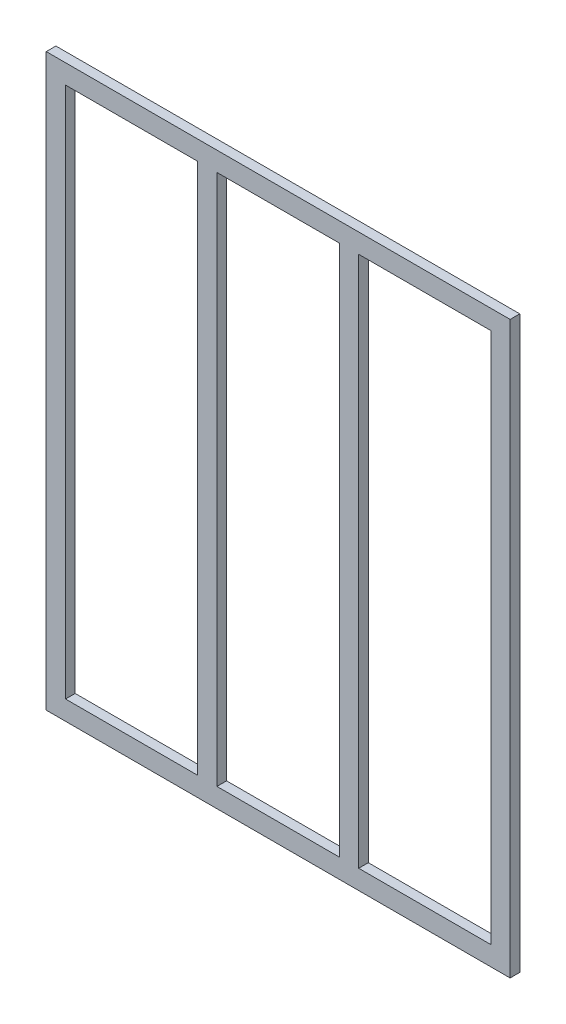
ISO-10303-21;
HEADER;
FILE_DESCRIPTION(('STEP AP214'),'2;1');
FILE_NAME('part.step','',(''),(''),'','','');
FILE_SCHEMA(('AUTOMOTIVE_DESIGN { 1 0 10303 214 1 1 1 1 }'));
ENDSEC;
DATA;
#1=APPLICATION_CONTEXT('core data for automotive mechanical design processes');
#2=APPLICATION_PROTOCOL_DEFINITION('international standard','automotive_design',2000,#1);
#3=PRODUCT_CONTEXT('',#1,'mechanical');
#4=PRODUCT('Part','Part','',(#3));
#5=PRODUCT_RELATED_PRODUCT_CATEGORY('part','',(#4));
#6=PRODUCT_DEFINITION_FORMATION('','',#4);
#7=PRODUCT_DEFINITION_CONTEXT('part definition',#1,'design');
#8=PRODUCT_DEFINITION('design','',#6,#7);
#9=PRODUCT_DEFINITION_SHAPE('','',#8);
#10=(LENGTH_UNIT() NAMED_UNIT(*) SI_UNIT(.MILLI.,.METRE.));
#11=(NAMED_UNIT(*) PLANE_ANGLE_UNIT() SI_UNIT($,.RADIAN.));
#12=(NAMED_UNIT(*) SI_UNIT($,.STERADIAN.) SOLID_ANGLE_UNIT());
#13=UNCERTAINTY_MEASURE_WITH_UNIT(LENGTH_MEASURE(1.E-05),#10,'distance_accuracy_value','');
#14=(GEOMETRIC_REPRESENTATION_CONTEXT(3) GLOBAL_UNCERTAINTY_ASSIGNED_CONTEXT((#13)) GLOBAL_UNIT_ASSIGNED_CONTEXT((#10,
#11,#12)) REPRESENTATION_CONTEXT('',''));
#15=CARTESIAN_POINT('',(0.,0.,0.));
#16=DIRECTION('',(0.,0.,1.));
#17=DIRECTION('',(1.,0.,0.));
#18=AXIS2_PLACEMENT_3D('',#15,#16,#17);
#19=CARTESIAN_POINT('',(-559.2,-699.2,25.4));
#20=DIRECTION('',(0.,1.,0.));
#21=DIRECTION('',(0.,0.,1.));
#22=AXIS2_PLACEMENT_3D('',#19,#20,#21);
#23=PLANE('',#22);
#24=DIRECTION('',(0.,0.,1.));
#25=VECTOR('',#24,1.);
#26=CARTESIAN_POINT('',(161.,-699.2,0.));
#27=LINE('',#26,#25);
#28=CARTESIAN_POINT('',(161.,-699.2,0.));
#29=VERTEX_POINT('',#28);
#30=CARTESIAN_POINT('',(161.,-699.2,25.4));
#31=VERTEX_POINT('',#30);
#32=EDGE_CURVE('E148',#29,#31,#27,.T.);
#33=ORIENTED_EDGE('',*,*,#32,.F.);
#34=DIRECTION('',(1.,0.,0.));
#35=VECTOR('',#34,1.);
#36=CARTESIAN_POINT('',(-559.2,-699.2,0.));
#37=LINE('',#36,#35);
#38=CARTESIAN_POINT('',(-161.,-699.2,0.));
#39=VERTEX_POINT('',#38);
#40=EDGE_CURVE('E158',#39,#29,#37,.T.);
#41=ORIENTED_EDGE('',*,*,#40,.F.);
#42=DIRECTION('',(0.,0.,1.));
#43=VECTOR('',#42,1.);
#44=CARTESIAN_POINT('',(-161.,-699.2,0.));
#45=LINE('',#44,#43);
#46=CARTESIAN_POINT('',(-161.,-699.2,25.4));
#47=VERTEX_POINT('',#46);
#48=EDGE_CURVE('E172',#39,#47,#45,.T.);
#49=ORIENTED_EDGE('',*,*,#48,.T.);
#50=DIRECTION('',(1.,0.,0.));
#51=VECTOR('',#50,1.);
#52=CARTESIAN_POINT('',(-559.2,-699.2,25.4));
#53=LINE('',#52,#51);
#54=EDGE_CURVE('E160',#47,#31,#53,.T.);
#55=ORIENTED_EDGE('',*,*,#54,.T.);
#56=EDGE_LOOP('',(#33,#41,#49,#55));
#57=FACE_BOUND('',#56,.T.);
#58=ADVANCED_FACE('F35',(#57),#23,.T.);
#59=CARTESIAN_POINT('',(-559.2,699.2,25.4));
#60=DIRECTION('',(0.,-1.,0.));
#61=DIRECTION('',(1.,0.,0.));
#62=AXIS2_PLACEMENT_3D('',#59,#60,#61);
#63=PLANE('',#62);
#64=DIRECTION('',(0.,0.,1.));
#65=VECTOR('',#64,1.);
#66=CARTESIAN_POINT('',(161.,699.2,0.));
#67=LINE('',#66,#65);
#68=CARTESIAN_POINT('',(161.,699.2,0.));
#69=VERTEX_POINT('',#68);
#70=CARTESIAN_POINT('',(161.,699.2,25.4));
#71=VERTEX_POINT('',#70);
#72=EDGE_CURVE('E151',#69,#71,#67,.T.);
#73=ORIENTED_EDGE('',*,*,#72,.T.);
#74=DIRECTION('',(-1.,0.,0.));
#75=VECTOR('',#74,1.);
#76=CARTESIAN_POINT('',(-559.2,699.2,25.4));
#77=LINE('',#76,#75);
#78=CARTESIAN_POINT('',(-161.,699.2,25.4));
#79=VERTEX_POINT('',#78);
#80=EDGE_CURVE('E310',#71,#79,#77,.T.);
#81=ORIENTED_EDGE('',*,*,#80,.T.);
#82=DIRECTION('',(0.,0.,1.));
#83=VECTOR('',#82,1.);
#84=CARTESIAN_POINT('',(-161.,699.2,0.));
#85=LINE('',#84,#83);
#86=CARTESIAN_POINT('',(-161.,699.2,0.));
#87=VERTEX_POINT('',#86);
#88=EDGE_CURVE('E292',#87,#79,#85,.T.);
#89=ORIENTED_EDGE('',*,*,#88,.F.);
#90=DIRECTION('',(-1.,0.,0.));
#91=VECTOR('',#90,1.);
#92=CARTESIAN_POINT('',(-559.2,699.2,0.));
#93=LINE('',#92,#91);
#94=EDGE_CURVE('E183',#69,#87,#93,.T.);
#95=ORIENTED_EDGE('',*,*,#94,.F.);
#96=EDGE_LOOP('',(#73,#81,#89,#95));
#97=FACE_BOUND('',#96,.T.);
#98=ADVANCED_FACE('F251',(#97),#63,.T.);
#99=DIRECTION('',(0.,0.,1.));
#100=VECTOR('',#99,1.);
#101=CARTESIAN_POINT('',(211.8,-699.2,0.));
#102=LINE('',#101,#100);
#103=CARTESIAN_POINT('',(211.8,-699.2,0.));
#104=VERTEX_POINT('',#103);
#105=CARTESIAN_POINT('',(211.8,-699.2,25.4));
#106=VERTEX_POINT('',#105);
#107=EDGE_CURVE('E161',#104,#106,#102,.T.);
#108=ORIENTED_EDGE('',*,*,#107,.T.);
#109=CARTESIAN_POINT('',(559.2,-699.2,25.4));
#110=VERTEX_POINT('',#109);
#111=EDGE_CURVE('E186',#106,#110,#53,.T.);
#112=ORIENTED_EDGE('',*,*,#111,.T.);
#113=DIRECTION('',(0.,0.,-1.));
#114=VECTOR('',#113,1.);
#115=CARTESIAN_POINT('',(559.2,-699.2,25.4));
#116=LINE('',#115,#114);
#117=CARTESIAN_POINT('',(559.2,-699.2,0.));
#118=VERTEX_POINT('',#117);
#119=EDGE_CURVE('E195',#110,#118,#116,.T.);
#120=ORIENTED_EDGE('',*,*,#119,.T.);
#121=EDGE_CURVE('E168',#104,#118,#37,.T.);
#122=ORIENTED_EDGE('',*,*,#121,.F.);
#123=EDGE_LOOP('',(#108,#112,#120,#122));
#124=FACE_BOUND('',#123,.T.);
#125=ADVANCED_FACE('F253',(#124),#23,.T.);
#126=DIRECTION('',(0.,0.,1.));
#127=VECTOR('',#126,1.);
#128=CARTESIAN_POINT('',(211.8,699.2,0.));
#129=LINE('',#128,#127);
#130=CARTESIAN_POINT('',(211.8,699.2,0.));
#131=VERTEX_POINT('',#130);
#132=CARTESIAN_POINT('',(211.8,699.2,25.4));
#133=VERTEX_POINT('',#132);
#134=EDGE_CURVE('E340',#131,#133,#129,.T.);
#135=ORIENTED_EDGE('',*,*,#134,.F.);
#136=CARTESIAN_POINT('',(559.2,699.2,0.));
#137=VERTEX_POINT('',#136);
#138=EDGE_CURVE('E180',#137,#131,#93,.T.);
#139=ORIENTED_EDGE('',*,*,#138,.F.);
#140=DIRECTION('',(0.,0.,-1.));
#141=VECTOR('',#140,1.);
#142=CARTESIAN_POINT('',(559.2,699.2,25.4));
#143=LINE('',#142,#141);
#144=CARTESIAN_POINT('',(559.2,699.2,25.4));
#145=VERTEX_POINT('',#144);
#146=EDGE_CURVE('E193',#145,#137,#143,.T.);
#147=ORIENTED_EDGE('',*,*,#146,.F.);
#148=EDGE_CURVE('E308',#145,#133,#77,.T.);
#149=ORIENTED_EDGE('',*,*,#148,.T.);
#150=EDGE_LOOP('',(#135,#139,#147,#149));
#151=FACE_BOUND('',#150,.T.);
#152=ADVANCED_FACE('F260',(#151),#63,.T.);
#153=CARTESIAN_POINT('',(0.,0.,25.4));
#154=DIRECTION('',(0.,0.,-1.));
#155=DIRECTION('',(-1.,0.,0.));
#156=AXIS2_PLACEMENT_3D('',#153,#154,#155);
#157=PLANE('',#156);
#158=ORIENTED_EDGE('',*,*,#80,.F.);
#159=DIRECTION('',(0.,-1.,0.));
#160=VECTOR('',#159,1.);
#161=CARTESIAN_POINT('',(161.,-699.2,25.4));
#162=LINE('',#161,#160);
#163=EDGE_CURVE('E334',#71,#31,#162,.T.);
#164=ORIENTED_EDGE('',*,*,#163,.T.);
#165=ORIENTED_EDGE('',*,*,#54,.F.);
#166=DIRECTION('',(0.,1.,0.));
#167=VECTOR('',#166,1.);
#168=CARTESIAN_POINT('',(-161.,-699.2,25.4));
#169=LINE('',#168,#167);
#170=EDGE_CURVE('E299',#47,#79,#169,.T.);
#171=ORIENTED_EDGE('',*,*,#170,.T.);
#172=EDGE_LOOP('',(#158,#164,#165,#171));
#173=FACE_BOUND('',#172,.T.);
#174=DIRECTION('',(0.,1.,0.));
#175=VECTOR('',#174,1.);
#176=CARTESIAN_POINT('',(211.8,-699.2,25.4));
#177=LINE('',#176,#175);
#178=EDGE_CURVE('E153',#106,#133,#177,.T.);
#179=ORIENTED_EDGE('',*,*,#178,.T.);
#180=ORIENTED_EDGE('',*,*,#148,.F.);
#181=DIRECTION('',(0.,1.,0.));
#182=VECTOR('',#181,1.);
#183=CARTESIAN_POINT('',(559.2,-699.2,25.4));
#184=LINE('',#183,#182);
#185=EDGE_CURVE('E306',#110,#145,#184,.T.);
#186=ORIENTED_EDGE('',*,*,#185,.F.);
#187=ORIENTED_EDGE('',*,*,#111,.F.);
#188=EDGE_LOOP('',(#179,#180,#186,#187));
#189=FACE_BOUND('',#188,.T.);
#190=DIRECTION('',(0.,1.,0.));
#191=VECTOR('',#190,1.);
#192=CARTESIAN_POINT('',(610.,-750.,25.4));
#193=LINE('',#192,#191);
#194=CARTESIAN_POINT('',(610.,-750.,25.4));
#195=VERTEX_POINT('',#194);
#196=CARTESIAN_POINT('',(610.,750.,25.4));
#197=VERTEX_POINT('',#196);
#198=EDGE_CURVE('E199',#195,#197,#193,.T.);
#199=ORIENTED_EDGE('',*,*,#198,.T.);
#200=DIRECTION('',(-1.,0.,0.));
#201=VECTOR('',#200,1.);
#202=CARTESIAN_POINT('',(-610.,750.,25.4));
#203=LINE('',#202,#201);
#204=CARTESIAN_POINT('',(-610.,750.,25.4));
#205=VERTEX_POINT('',#204);
#206=EDGE_CURVE('E202',#197,#205,#203,.T.);
#207=ORIENTED_EDGE('',*,*,#206,.T.);
#208=DIRECTION('',(0.,-1.,0.));
#209=VECTOR('',#208,1.);
#210=CARTESIAN_POINT('',(-610.,-750.,25.4));
#211=LINE('',#210,#209);
#212=CARTESIAN_POINT('',(-610.,-750.,25.4));
#213=VERTEX_POINT('',#212);
#214=EDGE_CURVE('E205',#205,#213,#211,.T.);
#215=ORIENTED_EDGE('',*,*,#214,.T.);
#216=DIRECTION('',(1.,0.,0.));
#217=VECTOR('',#216,1.);
#218=CARTESIAN_POINT('',(-610.,-750.,25.4));
#219=LINE('',#218,#217);
#220=EDGE_CURVE('E207',#213,#195,#219,.T.);
#221=ORIENTED_EDGE('',*,*,#220,.T.);
#222=EDGE_LOOP('',(#199,#207,#215,#221));
#223=FACE_BOUND('',#222,.T.);
#224=CARTESIAN_POINT('',(-559.2,-699.2,25.4));
#225=VERTEX_POINT('',#224);
#226=CARTESIAN_POINT('',(-211.8,-699.2,25.4));
#227=VERTEX_POINT('',#226);
#228=EDGE_CURVE('E279',#225,#227,#53,.T.);
#229=ORIENTED_EDGE('',*,*,#228,.F.);
#230=DIRECTION('',(0.,-1.,0.));
#231=VECTOR('',#230,1.);
#232=CARTESIAN_POINT('',(-559.2,-699.2,25.4));
#233=LINE('',#232,#231);
#234=CARTESIAN_POINT('',(-559.2,699.2,25.4));
#235=VERTEX_POINT('',#234);
#236=EDGE_CURVE('E175',#235,#225,#233,.T.);
#237=ORIENTED_EDGE('',*,*,#236,.F.);
#238=CARTESIAN_POINT('',(-211.8,699.2,25.4));
#239=VERTEX_POINT('',#238);
#240=EDGE_CURVE('E307',#239,#235,#77,.T.);
#241=ORIENTED_EDGE('',*,*,#240,.F.);
#242=DIRECTION('',(0.,-1.,0.));
#243=VECTOR('',#242,1.);
#244=CARTESIAN_POINT('',(-211.8,-699.2,25.4));
#245=LINE('',#244,#243);
#246=EDGE_CURVE('E296',#239,#227,#245,.T.);
#247=ORIENTED_EDGE('',*,*,#246,.T.);
#248=EDGE_LOOP('',(#229,#237,#241,#247));
#249=FACE_BOUND('',#248,.T.);
#250=ADVANCED_FACE('F241',(#173,#189,#223,#249),#157,.F.);
#251=CARTESIAN_POINT('',(0.,0.,0.));
#252=DIRECTION('',(0.,0.,-1.));
#253=DIRECTION('',(-1.,0.,0.));
#254=AXIS2_PLACEMENT_3D('',#251,#252,#253);
#255=PLANE('',#254);
#256=DIRECTION('',(0.,-1.,0.));
#257=VECTOR('',#256,1.);
#258=CARTESIAN_POINT('',(161.,-699.2,0.));
#259=LINE('',#258,#257);
#260=EDGE_CURVE('E50',#69,#29,#259,.T.);
#261=ORIENTED_EDGE('',*,*,#260,.F.);
#262=ORIENTED_EDGE('',*,*,#94,.T.);
#263=DIRECTION('',(0.,1.,0.));
#264=VECTOR('',#263,1.);
#265=CARTESIAN_POINT('',(-161.,-699.2,0.));
#266=LINE('',#265,#264);
#267=EDGE_CURVE('E166',#39,#87,#266,.T.);
#268=ORIENTED_EDGE('',*,*,#267,.F.);
#269=ORIENTED_EDGE('',*,*,#40,.T.);
#270=EDGE_LOOP('',(#261,#262,#268,#269));
#271=FACE_BOUND('',#270,.T.);
#272=ORIENTED_EDGE('',*,*,#138,.T.);
#273=DIRECTION('',(0.,1.,0.));
#274=VECTOR('',#273,1.);
#275=CARTESIAN_POINT('',(211.8,-699.2,0.));
#276=LINE('',#275,#274);
#277=EDGE_CURVE('E58',#104,#131,#276,.T.);
#278=ORIENTED_EDGE('',*,*,#277,.F.);
#279=ORIENTED_EDGE('',*,*,#121,.T.);
#280=DIRECTION('',(0.,1.,0.));
#281=VECTOR('',#280,1.);
#282=CARTESIAN_POINT('',(559.2,-699.2,0.));
#283=LINE('',#282,#281);
#284=EDGE_CURVE('E171',#118,#137,#283,.T.);
#285=ORIENTED_EDGE('',*,*,#284,.T.);
#286=EDGE_LOOP('',(#272,#278,#279,#285));
#287=FACE_BOUND('',#286,.T.);
#288=DIRECTION('',(0.,1.,0.));
#289=VECTOR('',#288,1.);
#290=CARTESIAN_POINT('',(610.,-750.,0.));
#291=LINE('',#290,#289);
#292=CARTESIAN_POINT('',(610.,-750.,0.));
#293=VERTEX_POINT('',#292);
#294=CARTESIAN_POINT('',(610.,750.,0.));
#295=VERTEX_POINT('',#294);
#296=EDGE_CURVE('E198',#293,#295,#291,.T.);
#297=ORIENTED_EDGE('',*,*,#296,.F.);
#298=DIRECTION('',(1.,0.,0.));
#299=VECTOR('',#298,1.);
#300=CARTESIAN_POINT('',(-610.,-750.,0.));
#301=LINE('',#300,#299);
#302=CARTESIAN_POINT('',(-610.,-750.,0.));
#303=VERTEX_POINT('',#302);
#304=EDGE_CURVE('E203',#303,#293,#301,.T.);
#305=ORIENTED_EDGE('',*,*,#304,.F.);
#306=DIRECTION('',(0.,-1.,0.));
#307=VECTOR('',#306,1.);
#308=CARTESIAN_POINT('',(-610.,-750.,0.));
#309=LINE('',#308,#307);
#310=CARTESIAN_POINT('',(-610.,750.,0.));
#311=VERTEX_POINT('',#310);
#312=EDGE_CURVE('E214',#311,#303,#309,.T.);
#313=ORIENTED_EDGE('',*,*,#312,.F.);
#314=DIRECTION('',(-1.,0.,0.));
#315=VECTOR('',#314,1.);
#316=CARTESIAN_POINT('',(-610.,750.,0.));
#317=LINE('',#316,#315);
#318=EDGE_CURVE('E212',#295,#311,#317,.T.);
#319=ORIENTED_EDGE('',*,*,#318,.F.);
#320=EDGE_LOOP('',(#297,#305,#313,#319));
#321=FACE_BOUND('',#320,.T.);
#322=DIRECTION('',(0.,-1.,0.));
#323=VECTOR('',#322,1.);
#324=CARTESIAN_POINT('',(-559.2,-699.2,0.));
#325=LINE('',#324,#323);
#326=CARTESIAN_POINT('',(-559.2,699.2,0.));
#327=VERTEX_POINT('',#326);
#328=CARTESIAN_POINT('',(-559.2,-699.2,0.));
#329=VERTEX_POINT('',#328);
#330=EDGE_CURVE('E182',#327,#329,#325,.T.);
#331=ORIENTED_EDGE('',*,*,#330,.T.);
#332=CARTESIAN_POINT('',(-211.8,-699.2,0.));
#333=VERTEX_POINT('',#332);
#334=EDGE_CURVE('E167',#329,#333,#37,.T.);
#335=ORIENTED_EDGE('',*,*,#334,.T.);
#336=DIRECTION('',(0.,-1.,0.));
#337=VECTOR('',#336,1.);
#338=CARTESIAN_POINT('',(-211.8,-699.2,0.));
#339=LINE('',#338,#337);
#340=CARTESIAN_POINT('',(-211.8,699.2,0.));
#341=VERTEX_POINT('',#340);
#342=EDGE_CURVE('E287',#341,#333,#339,.T.);
#343=ORIENTED_EDGE('',*,*,#342,.F.);
#344=EDGE_CURVE('E179',#341,#327,#93,.T.);
#345=ORIENTED_EDGE('',*,*,#344,.T.);
#346=EDGE_LOOP('',(#331,#335,#343,#345));
#347=FACE_BOUND('',#346,.T.);
#348=ADVANCED_FACE('F164',(#271,#287,#321,#347),#255,.T.);
#349=CARTESIAN_POINT('',(610.,-750.,25.4));
#350=DIRECTION('',(-1.,0.,0.));
#351=DIRECTION('',(0.,0.,1.));
#352=AXIS2_PLACEMENT_3D('',#349,#350,#351);
#353=PLANE('',#352);
#354=ORIENTED_EDGE('',*,*,#296,.T.);
#355=DIRECTION('',(0.,0.,-1.));
#356=VECTOR('',#355,1.);
#357=CARTESIAN_POINT('',(610.,750.,25.4));
#358=LINE('',#357,#356);
#359=EDGE_CURVE('E11',#197,#295,#358,.T.);
#360=ORIENTED_EDGE('',*,*,#359,.F.);
#361=ORIENTED_EDGE('',*,*,#198,.F.);
#362=DIRECTION('',(0.,0.,-1.));
#363=VECTOR('',#362,1.);
#364=CARTESIAN_POINT('',(610.,-750.,25.4));
#365=LINE('',#364,#363);
#366=EDGE_CURVE('E209',#195,#293,#365,.T.);
#367=ORIENTED_EDGE('',*,*,#366,.T.);
#368=EDGE_LOOP('',(#354,#360,#361,#367));
#369=FACE_BOUND('',#368,.T.);
#370=ADVANCED_FACE('F37',(#369),#353,.F.);
#371=CARTESIAN_POINT('',(-610.,750.,25.4));
#372=DIRECTION('',(0.,-1.,0.));
#373=DIRECTION('',(0.,0.,-1.));
#374=AXIS2_PLACEMENT_3D('',#371,#372,#373);
#375=PLANE('',#374);
#376=ORIENTED_EDGE('',*,*,#318,.T.);
#377=DIRECTION('',(0.,0.,-1.));
#378=VECTOR('',#377,1.);
#379=CARTESIAN_POINT('',(-610.,750.,25.4));
#380=LINE('',#379,#378);
#381=EDGE_CURVE('E43',#205,#311,#380,.T.);
#382=ORIENTED_EDGE('',*,*,#381,.F.);
#383=ORIENTED_EDGE('',*,*,#206,.F.);
#384=ORIENTED_EDGE('',*,*,#359,.T.);
#385=EDGE_LOOP('',(#376,#382,#383,#384));
#386=FACE_BOUND('',#385,.T.);
#387=ADVANCED_FACE('F243',(#386),#375,.F.);
#388=CARTESIAN_POINT('',(-610.,-750.,25.4));
#389=DIRECTION('',(1.,0.,0.));
#390=DIRECTION('',(0.,0.,-1.));
#391=AXIS2_PLACEMENT_3D('',#388,#389,#390);
#392=PLANE('',#391);
#393=ORIENTED_EDGE('',*,*,#312,.T.);
#394=DIRECTION('',(0.,0.,-1.));
#395=VECTOR('',#394,1.);
#396=CARTESIAN_POINT('',(-610.,-750.,25.4));
#397=LINE('',#396,#395);
#398=EDGE_CURVE('E219',#213,#303,#397,.T.);
#399=ORIENTED_EDGE('',*,*,#398,.F.);
#400=ORIENTED_EDGE('',*,*,#214,.F.);
#401=ORIENTED_EDGE('',*,*,#381,.T.);
#402=EDGE_LOOP('',(#393,#399,#400,#401));
#403=FACE_BOUND('',#402,.T.);
#404=ADVANCED_FACE('F226',(#403),#392,.F.);
#405=CARTESIAN_POINT('',(-610.,-750.,25.4));
#406=DIRECTION('',(0.,1.,0.));
#407=DIRECTION('',(0.,0.,1.));
#408=AXIS2_PLACEMENT_3D('',#405,#406,#407);
#409=PLANE('',#408);
#410=ORIENTED_EDGE('',*,*,#304,.T.);
#411=ORIENTED_EDGE('',*,*,#366,.F.);
#412=ORIENTED_EDGE('',*,*,#220,.F.);
#413=ORIENTED_EDGE('',*,*,#398,.T.);
#414=EDGE_LOOP('',(#410,#411,#412,#413));
#415=FACE_BOUND('',#414,.T.);
#416=ADVANCED_FACE('F235',(#415),#409,.F.);
#417=DIRECTION('',(0.,0.,1.));
#418=VECTOR('',#417,1.);
#419=CARTESIAN_POINT('',(-211.8,-699.2,0.));
#420=LINE('',#419,#418);
#421=EDGE_CURVE('E276',#333,#227,#420,.T.);
#422=ORIENTED_EDGE('',*,*,#421,.F.);
#423=ORIENTED_EDGE('',*,*,#334,.F.);
#424=DIRECTION('',(0.,0.,-1.));
#425=VECTOR('',#424,1.);
#426=CARTESIAN_POINT('',(-559.2,-699.2,25.4));
#427=LINE('',#426,#425);
#428=EDGE_CURVE('E187',#225,#329,#427,.T.);
#429=ORIENTED_EDGE('',*,*,#428,.F.);
#430=ORIENTED_EDGE('',*,*,#228,.T.);
#431=EDGE_LOOP('',(#422,#423,#429,#430));
#432=FACE_BOUND('',#431,.T.);
#433=ADVANCED_FACE('F254',(#432),#23,.T.);
#434=CARTESIAN_POINT('',(559.2,-699.2,25.4));
#435=DIRECTION('',(-1.,0.,0.));
#436=DIRECTION('',(0.,0.,1.));
#437=AXIS2_PLACEMENT_3D('',#434,#435,#436);
#438=PLANE('',#437);
#439=ORIENTED_EDGE('',*,*,#284,.F.);
#440=ORIENTED_EDGE('',*,*,#119,.F.);
#441=ORIENTED_EDGE('',*,*,#185,.T.);
#442=ORIENTED_EDGE('',*,*,#146,.T.);
#443=EDGE_LOOP('',(#439,#440,#441,#442));
#444=FACE_BOUND('',#443,.T.);
#445=ADVANCED_FACE('F267',(#444),#438,.T.);
#446=DIRECTION('',(0.,0.,1.));
#447=VECTOR('',#446,1.);
#448=CARTESIAN_POINT('',(-211.8,699.2,0.));
#449=LINE('',#448,#447);
#450=EDGE_CURVE('E284',#341,#239,#449,.T.);
#451=ORIENTED_EDGE('',*,*,#450,.T.);
#452=ORIENTED_EDGE('',*,*,#240,.T.);
#453=DIRECTION('',(0.,0.,-1.));
#454=VECTOR('',#453,1.);
#455=CARTESIAN_POINT('',(-559.2,699.2,25.4));
#456=LINE('',#455,#454);
#457=EDGE_CURVE('E190',#235,#327,#456,.T.);
#458=ORIENTED_EDGE('',*,*,#457,.T.);
#459=ORIENTED_EDGE('',*,*,#344,.F.);
#460=EDGE_LOOP('',(#451,#452,#458,#459));
#461=FACE_BOUND('',#460,.T.);
#462=ADVANCED_FACE('F261',(#461),#63,.T.);
#463=CARTESIAN_POINT('',(-559.2,-699.2,25.4));
#464=DIRECTION('',(1.,0.,0.));
#465=DIRECTION('',(0.,0.,-1.));
#466=AXIS2_PLACEMENT_3D('',#463,#464,#465);
#467=PLANE('',#466);
#468=ORIENTED_EDGE('',*,*,#330,.F.);
#469=ORIENTED_EDGE('',*,*,#457,.F.);
#470=ORIENTED_EDGE('',*,*,#236,.T.);
#471=ORIENTED_EDGE('',*,*,#428,.T.);
#472=EDGE_LOOP('',(#468,#469,#470,#471));
#473=FACE_BOUND('',#472,.T.);
#474=ADVANCED_FACE('F319',(#473),#467,.T.);
#475=CARTESIAN_POINT('',(-161.,-699.2,0.));
#476=DIRECTION('',(1.,0.,0.));
#477=DIRECTION('',(0.,0.,-1.));
#478=AXIS2_PLACEMENT_3D('',#475,#476,#477);
#479=PLANE('',#478);
#480=ORIENTED_EDGE('',*,*,#170,.F.);
#481=ORIENTED_EDGE('',*,*,#48,.F.);
#482=ORIENTED_EDGE('',*,*,#267,.T.);
#483=ORIENTED_EDGE('',*,*,#88,.T.);
#484=EDGE_LOOP('',(#480,#481,#482,#483));
#485=FACE_BOUND('',#484,.T.);
#486=ADVANCED_FACE('F356',(#485),#479,.T.);
#487=CARTESIAN_POINT('',(-211.8,-699.2,0.));
#488=DIRECTION('',(-1.,0.,0.));
#489=DIRECTION('',(0.,0.,1.));
#490=AXIS2_PLACEMENT_3D('',#487,#488,#489);
#491=PLANE('',#490);
#492=ORIENTED_EDGE('',*,*,#246,.F.);
#493=ORIENTED_EDGE('',*,*,#450,.F.);
#494=ORIENTED_EDGE('',*,*,#342,.T.);
#495=ORIENTED_EDGE('',*,*,#421,.T.);
#496=EDGE_LOOP('',(#492,#493,#494,#495));
#497=FACE_BOUND('',#496,.T.);
#498=ADVANCED_FACE('F290',(#497),#491,.T.);
#499=CARTESIAN_POINT('',(161.,-699.2,0.));
#500=DIRECTION('',(-1.,0.,0.));
#501=DIRECTION('',(0.,0.,1.));
#502=AXIS2_PLACEMENT_3D('',#499,#500,#501);
#503=PLANE('',#502);
#504=ORIENTED_EDGE('',*,*,#163,.F.);
#505=ORIENTED_EDGE('',*,*,#72,.F.);
#506=ORIENTED_EDGE('',*,*,#260,.T.);
#507=ORIENTED_EDGE('',*,*,#32,.T.);
#508=EDGE_LOOP('',(#504,#505,#506,#507));
#509=FACE_BOUND('',#508,.T.);
#510=ADVANCED_FACE('F147',(#509),#503,.T.);
#511=CARTESIAN_POINT('',(211.8,-699.2,0.));
#512=DIRECTION('',(1.,0.,0.));
#513=DIRECTION('',(0.,0.,-1.));
#514=AXIS2_PLACEMENT_3D('',#511,#512,#513);
#515=PLANE('',#514);
#516=ORIENTED_EDGE('',*,*,#178,.F.);
#517=ORIENTED_EDGE('',*,*,#107,.F.);
#518=ORIENTED_EDGE('',*,*,#277,.T.);
#519=ORIENTED_EDGE('',*,*,#134,.T.);
#520=EDGE_LOOP('',(#516,#517,#518,#519));
#521=FACE_BOUND('',#520,.T.);
#522=ADVANCED_FACE('F344',(#521),#515,.T.);
#523=CLOSED_SHELL('',(#58,#98,#125,#152,#250,#348,#370,#387,#404,#416,#433,#445,#462,#474,#486,
#498,#510,#522));
#524=MANIFOLD_SOLID_BREP('B2',#523);
#525=ADVANCED_BREP_SHAPE_REPRESENTATION('',(#18,#524),#14);
#526=SHAPE_DEFINITION_REPRESENTATION(#9,#525);
ENDSEC;
END-ISO-10303-21;
